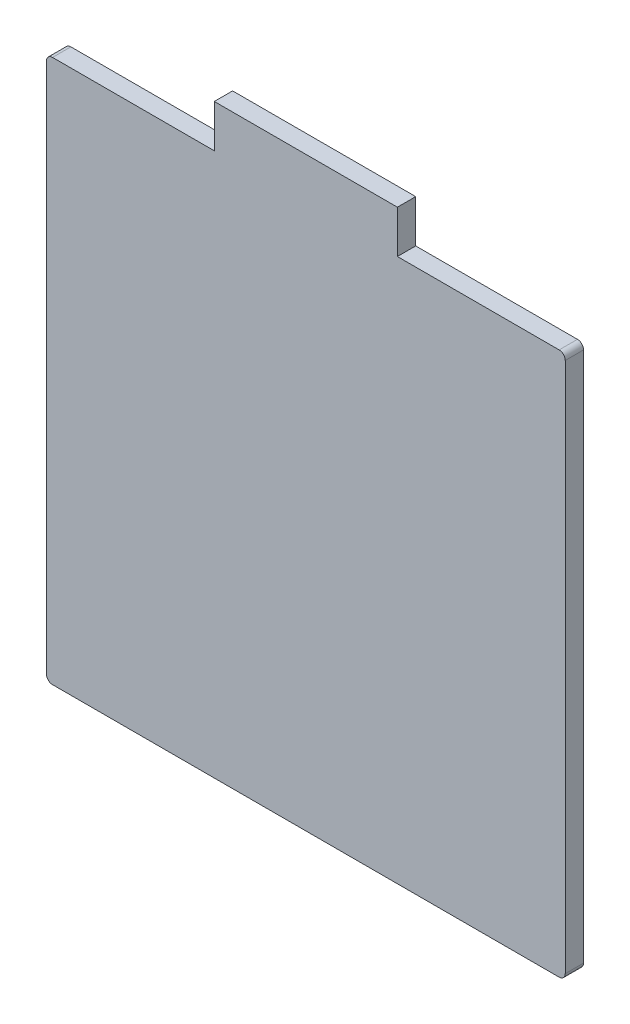
ISO-10303-21;
HEADER;
FILE_DESCRIPTION(('STEP AP214'),'2;1');
FILE_NAME('part.step','',(''),(''),'','','');
FILE_SCHEMA(('AUTOMOTIVE_DESIGN { 1 0 10303 214 1 1 1 1 }'));
ENDSEC;
DATA;
#1=APPLICATION_CONTEXT('core data for automotive mechanical design processes');
#2=APPLICATION_PROTOCOL_DEFINITION('international standard','automotive_design',2000,#1);
#3=PRODUCT_CONTEXT('',#1,'mechanical');
#4=PRODUCT('Part','Part','',(#3));
#5=PRODUCT_RELATED_PRODUCT_CATEGORY('part','',(#4));
#6=PRODUCT_DEFINITION_FORMATION('','',#4);
#7=PRODUCT_DEFINITION_CONTEXT('part definition',#1,'design');
#8=PRODUCT_DEFINITION('design','',#6,#7);
#9=PRODUCT_DEFINITION_SHAPE('','',#8);
#10=(LENGTH_UNIT() NAMED_UNIT(*) SI_UNIT(.MILLI.,.METRE.));
#11=(NAMED_UNIT(*) PLANE_ANGLE_UNIT() SI_UNIT($,.RADIAN.));
#12=(NAMED_UNIT(*) SI_UNIT($,.STERADIAN.) SOLID_ANGLE_UNIT());
#13=UNCERTAINTY_MEASURE_WITH_UNIT(LENGTH_MEASURE(1.E-05),#10,'distance_accuracy_value','');
#14=(GEOMETRIC_REPRESENTATION_CONTEXT(3) GLOBAL_UNCERTAINTY_ASSIGNED_CONTEXT((#13)) GLOBAL_UNIT_ASSIGNED_CONTEXT((#10,
#11,#12)) REPRESENTATION_CONTEXT('',''));
#15=CARTESIAN_POINT('',(0.,0.,0.));
#16=DIRECTION('',(0.,0.,1.));
#17=DIRECTION('',(1.,0.,0.));
#18=AXIS2_PLACEMENT_3D('',#15,#16,#17);
#19=CARTESIAN_POINT('',(425.,445.,30.));
#20=DIRECTION('',(0.,-1.,0.));
#21=DIRECTION('',(0.,0.,-1.));
#22=AXIS2_PLACEMENT_3D('',#19,#20,#21);
#23=PLANE('',#22);
#24=DIRECTION('',(0.,0.,1.));
#25=VECTOR('',#24,1.);
#26=CARTESIAN_POINT('',(-150.,445.,30.));
#27=LINE('',#26,#25);
#28=CARTESIAN_POINT('',(-150.,445.,0.));
#29=VERTEX_POINT('',#28);
#30=CARTESIAN_POINT('',(-150.,445.,30.));
#31=VERTEX_POINT('',#30);
#32=EDGE_CURVE('E233',#29,#31,#27,.T.);
#33=ORIENTED_EDGE('',*,*,#32,.F.);
#34=DIRECTION('',(-1.,0.,0.));
#35=VECTOR('',#34,1.);
#36=CARTESIAN_POINT('',(425.,445.,0.));
#37=LINE('',#36,#35);
#38=CARTESIAN_POINT('',(-415.,445.,0.));
#39=VERTEX_POINT('',#38);
#40=EDGE_CURVE('E155',#29,#39,#37,.T.);
#41=ORIENTED_EDGE('',*,*,#40,.T.);
#42=DIRECTION('',(0.,0.,-1.));
#43=VECTOR('',#42,1.);
#44=CARTESIAN_POINT('',(-415.,445.,30.));
#45=LINE('',#44,#43);
#46=CARTESIAN_POINT('',(-415.,445.,30.));
#47=VERTEX_POINT('',#46);
#48=EDGE_CURVE('E207',#39,#47,#45,.F.);
#49=ORIENTED_EDGE('',*,*,#48,.T.);
#50=DIRECTION('',(-1.,0.,0.));
#51=VECTOR('',#50,1.);
#52=CARTESIAN_POINT('',(425.,445.,30.));
#53=LINE('',#52,#51);
#54=EDGE_CURVE('E53',#31,#47,#53,.T.);
#55=ORIENTED_EDGE('',*,*,#54,.F.);
#56=EDGE_LOOP('',(#33,#41,#49,#55));
#57=FACE_BOUND('',#56,.T.);
#58=ADVANCED_FACE('F39',(#57),#23,.F.);
#59=DIRECTION('',(0.,0.,-1.));
#60=VECTOR('',#59,1.);
#61=CARTESIAN_POINT('',(150.,445.,0.));
#62=LINE('',#61,#60);
#63=CARTESIAN_POINT('',(150.,445.,30.));
#64=VERTEX_POINT('',#63);
#65=CARTESIAN_POINT('',(150.,445.,0.));
#66=VERTEX_POINT('',#65);
#67=EDGE_CURVE('E61',#64,#66,#62,.T.);
#68=ORIENTED_EDGE('',*,*,#67,.F.);
#69=CARTESIAN_POINT('',(415.,445.,30.));
#70=VERTEX_POINT('',#69);
#71=EDGE_CURVE('E166',#70,#64,#53,.T.);
#72=ORIENTED_EDGE('',*,*,#71,.F.);
#73=DIRECTION('',(0.,0.,-1.));
#74=VECTOR('',#73,1.);
#75=CARTESIAN_POINT('',(415.,445.,30.));
#76=LINE('',#75,#74);
#77=CARTESIAN_POINT('',(415.,445.,0.));
#78=VERTEX_POINT('',#77);
#79=EDGE_CURVE('E206',#70,#78,#76,.T.);
#80=ORIENTED_EDGE('',*,*,#79,.T.);
#81=EDGE_CURVE('E179',#78,#66,#37,.T.);
#82=ORIENTED_EDGE('',*,*,#81,.T.);
#83=EDGE_LOOP('',(#68,#72,#80,#82));
#84=FACE_BOUND('',#83,.T.);
#85=ADVANCED_FACE('F221',(#84),#23,.F.);
#86=CARTESIAN_POINT('',(425.,-445.,30.));
#87=DIRECTION('',(0.,1.,0.));
#88=DIRECTION('',(0.,0.,1.));
#89=AXIS2_PLACEMENT_3D('',#86,#87,#88);
#90=PLANE('',#89);
#91=DIRECTION('',(1.,0.,0.));
#92=VECTOR('',#91,1.);
#93=CARTESIAN_POINT('',(425.,-445.,30.));
#94=LINE('',#93,#92);
#95=CARTESIAN_POINT('',(-415.,-445.,30.));
#96=VERTEX_POINT('',#95);
#97=CARTESIAN_POINT('',(415.,-445.,30.));
#98=VERTEX_POINT('',#97);
#99=EDGE_CURVE('E165',#96,#98,#94,.T.);
#100=ORIENTED_EDGE('',*,*,#99,.F.);
#101=DIRECTION('',(0.,0.,-1.));
#102=VECTOR('',#101,1.);
#103=CARTESIAN_POINT('',(-415.,-445.,30.));
#104=LINE('',#103,#102);
#105=CARTESIAN_POINT('',(-415.,-445.,0.));
#106=VERTEX_POINT('',#105);
#107=EDGE_CURVE('E185',#96,#106,#104,.T.);
#108=ORIENTED_EDGE('',*,*,#107,.T.);
#109=DIRECTION('',(1.,0.,0.));
#110=VECTOR('',#109,1.);
#111=CARTESIAN_POINT('',(425.,-445.,0.));
#112=LINE('',#111,#110);
#113=CARTESIAN_POINT('',(415.,-445.,0.));
#114=VERTEX_POINT('',#113);
#115=EDGE_CURVE('E153',#106,#114,#112,.T.);
#116=ORIENTED_EDGE('',*,*,#115,.T.);
#117=DIRECTION('',(0.,0.,-1.));
#118=VECTOR('',#117,1.);
#119=CARTESIAN_POINT('',(415.,-445.,30.));
#120=LINE('',#119,#118);
#121=EDGE_CURVE('E175',#114,#98,#120,.F.);
#122=ORIENTED_EDGE('',*,*,#121,.T.);
#123=EDGE_LOOP('',(#100,#108,#116,#122));
#124=FACE_BOUND('',#123,.T.);
#125=ADVANCED_FACE('F255',(#124),#90,.F.);
#126=CARTESIAN_POINT('',(425.,445.,30.));
#127=DIRECTION('',(-1.,0.,0.));
#128=DIRECTION('',(0.,-1.,0.));
#129=AXIS2_PLACEMENT_3D('',#126,#127,#128);
#130=PLANE('',#129);
#131=DIRECTION('',(0.,1.,0.));
#132=VECTOR('',#131,1.);
#133=CARTESIAN_POINT('',(425.,445.,0.));
#134=LINE('',#133,#132);
#135=CARTESIAN_POINT('',(425.,-435.,0.));
#136=VERTEX_POINT('',#135);
#137=CARTESIAN_POINT('',(425.,435.,0.));
#138=VERTEX_POINT('',#137);
#139=EDGE_CURVE('E156',#136,#138,#134,.T.);
#140=ORIENTED_EDGE('',*,*,#139,.T.);
#141=DIRECTION('',(0.,0.,-1.));
#142=VECTOR('',#141,1.);
#143=CARTESIAN_POINT('',(425.,435.,30.));
#144=LINE('',#143,#142);
#145=CARTESIAN_POINT('',(425.,435.,30.));
#146=VERTEX_POINT('',#145);
#147=EDGE_CURVE('E11',#138,#146,#144,.F.);
#148=ORIENTED_EDGE('',*,*,#147,.T.);
#149=DIRECTION('',(0.,1.,0.));
#150=VECTOR('',#149,1.);
#151=CARTESIAN_POINT('',(425.,445.,30.));
#152=LINE('',#151,#150);
#153=CARTESIAN_POINT('',(425.,-435.,30.));
#154=VERTEX_POINT('',#153);
#155=EDGE_CURVE('E164',#154,#146,#152,.T.);
#156=ORIENTED_EDGE('',*,*,#155,.F.);
#157=DIRECTION('',(0.,0.,-1.));
#158=VECTOR('',#157,1.);
#159=CARTESIAN_POINT('',(425.,-435.,30.));
#160=LINE('',#159,#158);
#161=EDGE_CURVE('E50',#154,#136,#160,.T.);
#162=ORIENTED_EDGE('',*,*,#161,.T.);
#163=EDGE_LOOP('',(#140,#148,#156,#162));
#164=FACE_BOUND('',#163,.T.);
#165=ADVANCED_FACE('F214',(#164),#130,.F.);
#166=CARTESIAN_POINT('',(-425.,445.,30.));
#167=DIRECTION('',(1.,0.,0.));
#168=DIRECTION('',(0.,1.,0.));
#169=AXIS2_PLACEMENT_3D('',#166,#167,#168);
#170=PLANE('',#169);
#171=DIRECTION('',(0.,-1.,0.));
#172=VECTOR('',#171,1.);
#173=CARTESIAN_POINT('',(-425.,445.,0.));
#174=LINE('',#173,#172);
#175=CARTESIAN_POINT('',(-425.,435.,0.));
#176=VERTEX_POINT('',#175);
#177=CARTESIAN_POINT('',(-425.,-435.,0.));
#178=VERTEX_POINT('',#177);
#179=EDGE_CURVE('E167',#176,#178,#174,.T.);
#180=ORIENTED_EDGE('',*,*,#179,.T.);
#181=DIRECTION('',(0.,0.,-1.));
#182=VECTOR('',#181,1.);
#183=CARTESIAN_POINT('',(-425.,-435.,30.));
#184=LINE('',#183,#182);
#185=CARTESIAN_POINT('',(-425.,-435.,30.));
#186=VERTEX_POINT('',#185);
#187=EDGE_CURVE('E198',#178,#186,#184,.F.);
#188=ORIENTED_EDGE('',*,*,#187,.T.);
#189=DIRECTION('',(0.,-1.,0.));
#190=VECTOR('',#189,1.);
#191=CARTESIAN_POINT('',(-425.,445.,30.));
#192=LINE('',#191,#190);
#193=CARTESIAN_POINT('',(-425.,435.,30.));
#194=VERTEX_POINT('',#193);
#195=EDGE_CURVE('E174',#194,#186,#192,.T.);
#196=ORIENTED_EDGE('',*,*,#195,.F.);
#197=DIRECTION('',(0.,0.,-1.));
#198=VECTOR('',#197,1.);
#199=CARTESIAN_POINT('',(-425.,435.,30.));
#200=LINE('',#199,#198);
#201=EDGE_CURVE('E195',#194,#176,#200,.T.);
#202=ORIENTED_EDGE('',*,*,#201,.T.);
#203=EDGE_LOOP('',(#180,#188,#196,#202));
#204=FACE_BOUND('',#203,.T.);
#205=ADVANCED_FACE('F247',(#204),#170,.F.);
#206=CARTESIAN_POINT('',(0.,0.,30.));
#207=DIRECTION('',(0.,0.,1.));
#208=DIRECTION('',(1.,0.,0.));
#209=AXIS2_PLACEMENT_3D('',#206,#207,#208);
#210=PLANE('',#209);
#211=ORIENTED_EDGE('',*,*,#195,.T.);
#212=CARTESIAN_POINT('',(-415.,-435.,30.));
#213=DIRECTION('',(0.,0.,1.));
#214=DIRECTION('',(1.,0.,0.));
#215=AXIS2_PLACEMENT_3D('',#212,#213,#214);
#216=CIRCLE('',#215,10.);
#217=EDGE_CURVE('E204',#186,#96,#216,.T.);
#218=ORIENTED_EDGE('',*,*,#217,.T.);
#219=ORIENTED_EDGE('',*,*,#99,.T.);
#220=CARTESIAN_POINT('',(415.,-435.,30.));
#221=DIRECTION('',(0.,0.,1.));
#222=DIRECTION('',(1.,0.,0.));
#223=AXIS2_PLACEMENT_3D('',#220,#221,#222);
#224=CIRCLE('',#223,10.);
#225=EDGE_CURVE('E196',#98,#154,#224,.T.);
#226=ORIENTED_EDGE('',*,*,#225,.T.);
#227=ORIENTED_EDGE('',*,*,#155,.T.);
#228=CARTESIAN_POINT('',(415.,435.,30.));
#229=DIRECTION('',(0.,0.,1.));
#230=DIRECTION('',(1.,0.,0.));
#231=AXIS2_PLACEMENT_3D('',#228,#229,#230);
#232=CIRCLE('',#231,10.);
#233=EDGE_CURVE('E199',#146,#70,#232,.T.);
#234=ORIENTED_EDGE('',*,*,#233,.T.);
#235=ORIENTED_EDGE('',*,*,#71,.T.);
#236=DIRECTION('',(0.,-1.,0.));
#237=VECTOR('',#236,1.);
#238=CARTESIAN_POINT('',(150.,515.,30.));
#239=LINE('',#238,#237);
#240=CARTESIAN_POINT('',(150.,515.,30.));
#241=VERTEX_POINT('',#240);
#242=EDGE_CURVE('E158',#241,#64,#239,.T.);
#243=ORIENTED_EDGE('',*,*,#242,.F.);
#244=DIRECTION('',(1.,0.,0.));
#245=VECTOR('',#244,1.);
#246=CARTESIAN_POINT('',(150.,515.,30.));
#247=LINE('',#246,#245);
#248=CARTESIAN_POINT('',(-150.,515.,30.));
#249=VERTEX_POINT('',#248);
#250=EDGE_CURVE('E139',#249,#241,#247,.T.);
#251=ORIENTED_EDGE('',*,*,#250,.F.);
#252=DIRECTION('',(0.,-1.,0.));
#253=VECTOR('',#252,1.);
#254=CARTESIAN_POINT('',(-150.,515.,30.));
#255=LINE('',#254,#253);
#256=EDGE_CURVE('E133',#249,#31,#255,.T.);
#257=ORIENTED_EDGE('',*,*,#256,.T.);
#258=ORIENTED_EDGE('',*,*,#54,.T.);
#259=CARTESIAN_POINT('',(-415.,435.,30.));
#260=DIRECTION('',(0.,0.,1.));
#261=DIRECTION('',(1.,0.,0.));
#262=AXIS2_PLACEMENT_3D('',#259,#260,#261);
#263=CIRCLE('',#262,10.);
#264=EDGE_CURVE('E205',#47,#194,#263,.T.);
#265=ORIENTED_EDGE('',*,*,#264,.T.);
#266=EDGE_LOOP('',(#211,#218,#219,#226,#227,#234,#235,#243,#251,#257,#258,#265));
#267=FACE_BOUND('',#266,.T.);
#268=ADVANCED_FACE('F230',(#267),#210,.T.);
#269=CARTESIAN_POINT('',(0.,0.,0.));
#270=DIRECTION('',(0.,0.,1.));
#271=DIRECTION('',(1.,0.,0.));
#272=AXIS2_PLACEMENT_3D('',#269,#270,#271);
#273=PLANE('',#272);
#274=ORIENTED_EDGE('',*,*,#115,.F.);
#275=CARTESIAN_POINT('',(-415.,-435.,0.));
#276=DIRECTION('',(0.,0.,1.));
#277=DIRECTION('',(1.,0.,0.));
#278=AXIS2_PLACEMENT_3D('',#275,#276,#277);
#279=CIRCLE('',#278,10.);
#280=EDGE_CURVE('E192',#106,#178,#279,.F.);
#281=ORIENTED_EDGE('',*,*,#280,.T.);
#282=ORIENTED_EDGE('',*,*,#179,.F.);
#283=CARTESIAN_POINT('',(-415.,435.,0.));
#284=DIRECTION('',(0.,0.,1.));
#285=DIRECTION('',(1.,0.,0.));
#286=AXIS2_PLACEMENT_3D('',#283,#284,#285);
#287=CIRCLE('',#286,10.);
#288=EDGE_CURVE('E188',#176,#39,#287,.F.);
#289=ORIENTED_EDGE('',*,*,#288,.T.);
#290=ORIENTED_EDGE('',*,*,#40,.F.);
#291=DIRECTION('',(0.,-1.,0.));
#292=VECTOR('',#291,1.);
#293=CARTESIAN_POINT('',(-150.,515.,0.));
#294=LINE('',#293,#292);
#295=CARTESIAN_POINT('',(-150.,515.,0.));
#296=VERTEX_POINT('',#295);
#297=EDGE_CURVE('E131',#296,#29,#294,.T.);
#298=ORIENTED_EDGE('',*,*,#297,.F.);
#299=DIRECTION('',(-1.,0.,0.));
#300=VECTOR('',#299,1.);
#301=CARTESIAN_POINT('',(-150.,515.,0.));
#302=LINE('',#301,#300);
#303=CARTESIAN_POINT('',(150.,515.,0.));
#304=VERTEX_POINT('',#303);
#305=EDGE_CURVE('E140',#304,#296,#302,.T.);
#306=ORIENTED_EDGE('',*,*,#305,.F.);
#307=DIRECTION('',(0.,-1.,0.));
#308=VECTOR('',#307,1.);
#309=CARTESIAN_POINT('',(150.,515.,0.));
#310=LINE('',#309,#308);
#311=EDGE_CURVE('E232',#304,#66,#310,.T.);
#312=ORIENTED_EDGE('',*,*,#311,.T.);
#313=ORIENTED_EDGE('',*,*,#81,.F.);
#314=CARTESIAN_POINT('',(415.,435.,0.));
#315=DIRECTION('',(0.,0.,1.));
#316=DIRECTION('',(1.,0.,0.));
#317=AXIS2_PLACEMENT_3D('',#314,#315,#316);
#318=CIRCLE('',#317,10.);
#319=EDGE_CURVE('E186',#78,#138,#318,.F.);
#320=ORIENTED_EDGE('',*,*,#319,.T.);
#321=ORIENTED_EDGE('',*,*,#139,.F.);
#322=CARTESIAN_POINT('',(415.,-435.,0.));
#323=DIRECTION('',(0.,0.,1.));
#324=DIRECTION('',(1.,0.,0.));
#325=AXIS2_PLACEMENT_3D('',#322,#323,#324);
#326=CIRCLE('',#325,10.);
#327=EDGE_CURVE('E183',#136,#114,#326,.F.);
#328=ORIENTED_EDGE('',*,*,#327,.T.);
#329=EDGE_LOOP('',(#274,#281,#282,#289,#290,#298,#306,#312,#313,#320,#321,#328));
#330=FACE_BOUND('',#329,.T.);
#331=ADVANCED_FACE('F147',(#330),#273,.F.);
#332=CARTESIAN_POINT('',(-415.,-435.,30.));
#333=DIRECTION('',(0.,0.,-1.));
#334=DIRECTION('',(-1.,0.,0.));
#335=AXIS2_PLACEMENT_3D('',#332,#333,#334);
#336=CYLINDRICAL_SURFACE('',#335,10.);
#337=ORIENTED_EDGE('',*,*,#217,.F.);
#338=ORIENTED_EDGE('',*,*,#187,.F.);
#339=ORIENTED_EDGE('',*,*,#280,.F.);
#340=ORIENTED_EDGE('',*,*,#107,.F.);
#341=EDGE_LOOP('',(#337,#338,#339,#340));
#342=FACE_BOUND('',#341,.T.);
#343=ADVANCED_FACE('F253',(#342),#336,.T.);
#344=CARTESIAN_POINT('',(-415.,435.,30.));
#345=DIRECTION('',(0.,0.,-1.));
#346=DIRECTION('',(-1.,0.,0.));
#347=AXIS2_PLACEMENT_3D('',#344,#345,#346);
#348=CYLINDRICAL_SURFACE('',#347,10.);
#349=ORIENTED_EDGE('',*,*,#264,.F.);
#350=ORIENTED_EDGE('',*,*,#48,.F.);
#351=ORIENTED_EDGE('',*,*,#288,.F.);
#352=ORIENTED_EDGE('',*,*,#201,.F.);
#353=EDGE_LOOP('',(#349,#350,#351,#352));
#354=FACE_BOUND('',#353,.T.);
#355=ADVANCED_FACE('F245',(#354),#348,.T.);
#356=CARTESIAN_POINT('',(415.,435.,30.));
#357=DIRECTION('',(0.,0.,-1.));
#358=DIRECTION('',(-1.,0.,0.));
#359=AXIS2_PLACEMENT_3D('',#356,#357,#358);
#360=CYLINDRICAL_SURFACE('',#359,10.);
#361=ORIENTED_EDGE('',*,*,#233,.F.);
#362=ORIENTED_EDGE('',*,*,#147,.F.);
#363=ORIENTED_EDGE('',*,*,#319,.F.);
#364=ORIENTED_EDGE('',*,*,#79,.F.);
#365=EDGE_LOOP('',(#361,#362,#363,#364));
#366=FACE_BOUND('',#365,.T.);
#367=ADVANCED_FACE('F224',(#366),#360,.T.);
#368=CARTESIAN_POINT('',(415.,-435.,30.));
#369=DIRECTION('',(0.,0.,-1.));
#370=DIRECTION('',(-1.,0.,0.));
#371=AXIS2_PLACEMENT_3D('',#368,#369,#370);
#372=CYLINDRICAL_SURFACE('',#371,10.);
#373=ORIENTED_EDGE('',*,*,#225,.F.);
#374=ORIENTED_EDGE('',*,*,#121,.F.);
#375=ORIENTED_EDGE('',*,*,#327,.F.);
#376=ORIENTED_EDGE('',*,*,#161,.F.);
#377=EDGE_LOOP('',(#373,#374,#375,#376));
#378=FACE_BOUND('',#377,.T.);
#379=ADVANCED_FACE('F41',(#378),#372,.T.);
#380=CARTESIAN_POINT('',(-150.,515.,30.));
#381=DIRECTION('',(1.,0.,0.));
#382=DIRECTION('',(0.,0.,-1.));
#383=AXIS2_PLACEMENT_3D('',#380,#381,#382);
#384=PLANE('',#383);
#385=ORIENTED_EDGE('',*,*,#32,.T.);
#386=ORIENTED_EDGE('',*,*,#256,.F.);
#387=DIRECTION('',(0.,0.,1.));
#388=VECTOR('',#387,1.);
#389=CARTESIAN_POINT('',(-150.,515.,30.));
#390=LINE('',#389,#388);
#391=EDGE_CURVE('E126',#296,#249,#390,.T.);
#392=ORIENTED_EDGE('',*,*,#391,.F.);
#393=ORIENTED_EDGE('',*,*,#297,.T.);
#394=EDGE_LOOP('',(#385,#386,#392,#393));
#395=FACE_BOUND('',#394,.T.);
#396=ADVANCED_FACE('F128',(#395),#384,.F.);
#397=CARTESIAN_POINT('',(150.,515.,0.));
#398=DIRECTION('',(-1.,0.,0.));
#399=DIRECTION('',(0.,0.,1.));
#400=AXIS2_PLACEMENT_3D('',#397,#398,#399);
#401=PLANE('',#400);
#402=ORIENTED_EDGE('',*,*,#67,.T.);
#403=ORIENTED_EDGE('',*,*,#311,.F.);
#404=DIRECTION('',(0.,0.,-1.));
#405=VECTOR('',#404,1.);
#406=CARTESIAN_POINT('',(150.,515.,0.));
#407=LINE('',#406,#405);
#408=EDGE_CURVE('E141',#241,#304,#407,.T.);
#409=ORIENTED_EDGE('',*,*,#408,.F.);
#410=ORIENTED_EDGE('',*,*,#242,.T.);
#411=EDGE_LOOP('',(#402,#403,#409,#410));
#412=FACE_BOUND('',#411,.T.);
#413=ADVANCED_FACE('F227',(#412),#401,.F.);
#414=CARTESIAN_POINT('',(0.,515.,0.));
#415=DIRECTION('',(0.,-1.,0.));
#416=DIRECTION('',(0.,0.,-1.));
#417=AXIS2_PLACEMENT_3D('',#414,#415,#416);
#418=PLANE('',#417);
#419=ORIENTED_EDGE('',*,*,#305,.T.);
#420=ORIENTED_EDGE('',*,*,#391,.T.);
#421=ORIENTED_EDGE('',*,*,#250,.T.);
#422=ORIENTED_EDGE('',*,*,#408,.T.);
#423=EDGE_LOOP('',(#419,#420,#421,#422));
#424=FACE_BOUND('',#423,.T.);
#425=ADVANCED_FACE('F143',(#424),#418,.F.);
#426=CLOSED_SHELL('',(#58,#85,#125,#165,#205,#268,#331,#343,#355,#367,#379,#396,#413,#425));
#427=MANIFOLD_SOLID_BREP('B2',#426);
#428=ADVANCED_BREP_SHAPE_REPRESENTATION('',(#18,#427),#14);
#429=SHAPE_DEFINITION_REPRESENTATION(#9,#428);
ENDSEC;
END-ISO-10303-21;
